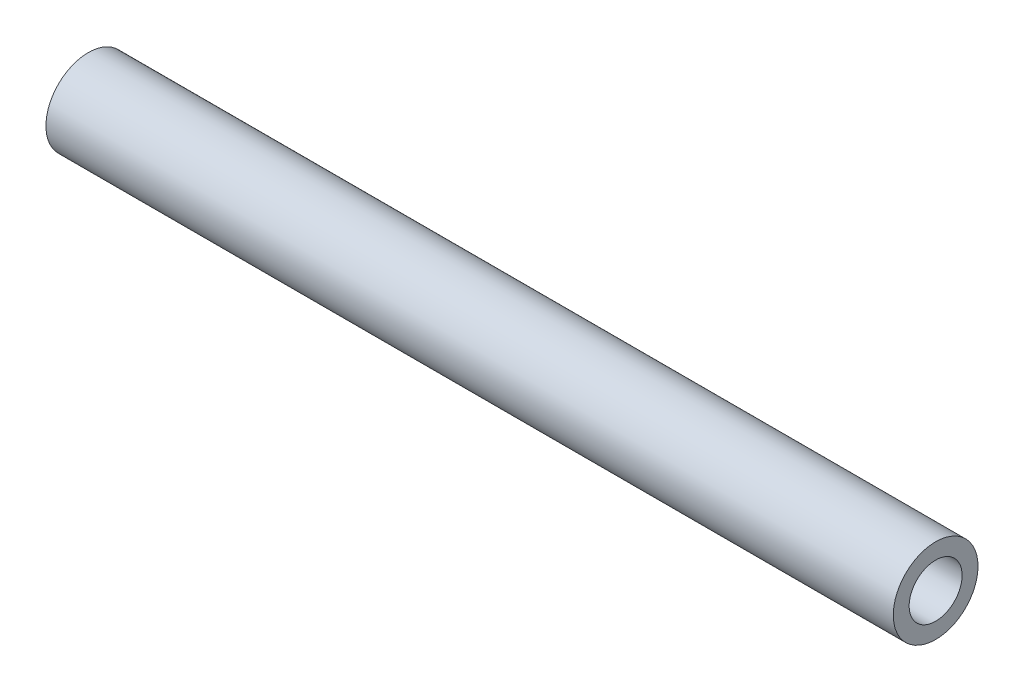
ISO-10303-21;
HEADER;
FILE_DESCRIPTION(('STEP AP214'),'2;1');
FILE_NAME('part.step','',(''),(''),'','','');
FILE_SCHEMA(('AUTOMOTIVE_DESIGN { 1 0 10303 214 1 1 1 1 }'));
ENDSEC;
DATA;
#1=APPLICATION_CONTEXT('core data for automotive mechanical design processes');
#2=APPLICATION_PROTOCOL_DEFINITION('international standard','automotive_design',2000,#1);
#3=PRODUCT_CONTEXT('',#1,'mechanical');
#4=PRODUCT('Part','Part','',(#3));
#5=PRODUCT_RELATED_PRODUCT_CATEGORY('part','',(#4));
#6=PRODUCT_DEFINITION_FORMATION('','',#4);
#7=PRODUCT_DEFINITION_CONTEXT('part definition',#1,'design');
#8=PRODUCT_DEFINITION('design','',#6,#7);
#9=PRODUCT_DEFINITION_SHAPE('','',#8);
#10=(LENGTH_UNIT() NAMED_UNIT(*) SI_UNIT(.MILLI.,.METRE.));
#11=(NAMED_UNIT(*) PLANE_ANGLE_UNIT() SI_UNIT($,.RADIAN.));
#12=(NAMED_UNIT(*) SI_UNIT($,.STERADIAN.) SOLID_ANGLE_UNIT());
#13=UNCERTAINTY_MEASURE_WITH_UNIT(LENGTH_MEASURE(1.E-05),#10,'distance_accuracy_value','');
#14=(GEOMETRIC_REPRESENTATION_CONTEXT(3) GLOBAL_UNCERTAINTY_ASSIGNED_CONTEXT((#13)) GLOBAL_UNIT_ASSIGNED_CONTEXT((#10,
#11,#12)) REPRESENTATION_CONTEXT('',''));
#15=CARTESIAN_POINT('',(0.,0.,0.));
#16=DIRECTION('',(0.,0.,1.));
#17=DIRECTION('',(1.,0.,0.));
#18=AXIS2_PLACEMENT_3D('',#15,#16,#17);
#19=CARTESIAN_POINT('',(127.,0.,0.));
#20=DIRECTION('',(1.,0.,0.));
#21=DIRECTION('',(0.,0.,-1.));
#22=AXIS2_PLACEMENT_3D('',#19,#20,#21);
#23=PLANE('',#22);
#24=CARTESIAN_POINT('',(127.,0.,0.));
#25=DIRECTION('',(1.,0.,0.));
#26=DIRECTION('',(0.,0.,-1.));
#27=AXIS2_PLACEMENT_3D('',#24,#25,#26);
#28=CIRCLE('',#27,6.35);
#29=CARTESIAN_POINT('',(127.,0.,-6.35));
#30=VERTEX_POINT('',#29);
#31=EDGE_CURVE('E10',#30,#30,#28,.T.);
#32=ORIENTED_EDGE('',*,*,#31,.T.);
#33=EDGE_LOOP('',(#32));
#34=FACE_BOUND('',#33,.T.);
#35=CARTESIAN_POINT('',(127.,0.,0.));
#36=DIRECTION('',(1.,0.,0.));
#37=DIRECTION('',(0.,0.,-1.));
#38=AXIS2_PLACEMENT_3D('',#35,#36,#37);
#39=CIRCLE('',#38,3.96875);
#40=CARTESIAN_POINT('',(127.,0.,-3.96875));
#41=VERTEX_POINT('',#40);
#42=EDGE_CURVE('E42',#41,#41,#39,.T.);
#43=ORIENTED_EDGE('',*,*,#42,.F.);
#44=EDGE_LOOP('',(#43));
#45=FACE_BOUND('',#44,.T.);
#46=ADVANCED_FACE('F31',(#34,#45),#23,.T.);
#47=CARTESIAN_POINT('',(0.,0.,0.));
#48=DIRECTION('',(1.,0.,0.));
#49=DIRECTION('',(0.,0.,-1.));
#50=AXIS2_PLACEMENT_3D('',#47,#48,#49);
#51=PLANE('',#50);
#52=CARTESIAN_POINT('',(0.,0.,0.));
#53=DIRECTION('',(1.,0.,0.));
#54=DIRECTION('',(0.,0.,-1.));
#55=AXIS2_PLACEMENT_3D('',#52,#53,#54);
#56=CIRCLE('',#55,6.35);
#57=CARTESIAN_POINT('',(0.,0.,-6.35));
#58=VERTEX_POINT('',#57);
#59=EDGE_CURVE('E35',#58,#58,#56,.T.);
#60=ORIENTED_EDGE('',*,*,#59,.F.);
#61=EDGE_LOOP('',(#60));
#62=FACE_BOUND('',#61,.T.);
#63=CARTESIAN_POINT('',(0.,0.,0.));
#64=DIRECTION('',(1.,0.,0.));
#65=DIRECTION('',(0.,0.,-1.));
#66=AXIS2_PLACEMENT_3D('',#63,#64,#65);
#67=CIRCLE('',#66,3.96875);
#68=CARTESIAN_POINT('',(0.,0.,-3.96875));
#69=VERTEX_POINT('',#68);
#70=EDGE_CURVE('E44',#69,#69,#67,.T.);
#71=ORIENTED_EDGE('',*,*,#70,.T.);
#72=EDGE_LOOP('',(#71));
#73=FACE_BOUND('',#72,.T.);
#74=ADVANCED_FACE('F54',(#62,#73),#51,.F.);
#75=CARTESIAN_POINT('',(127.,0.,0.));
#76=DIRECTION('',(-1.,0.,0.));
#77=DIRECTION('',(0.,0.,1.));
#78=AXIS2_PLACEMENT_3D('',#75,#76,#77);
#79=CYLINDRICAL_SURFACE('',#78,6.35);
#80=ORIENTED_EDGE('',*,*,#31,.F.);
#81=EDGE_LOOP('',(#80));
#82=FACE_BOUND('',#81,.T.);
#83=ORIENTED_EDGE('',*,*,#59,.T.);
#84=EDGE_LOOP('',(#83));
#85=FACE_BOUND('',#84,.T.);
#86=ADVANCED_FACE('F33',(#82,#85),#79,.T.);
#87=CARTESIAN_POINT('',(127.,0.,0.));
#88=DIRECTION('',(-1.,0.,0.));
#89=DIRECTION('',(0.,0.,1.));
#90=AXIS2_PLACEMENT_3D('',#87,#88,#89);
#91=CYLINDRICAL_SURFACE('',#90,3.96875);
#92=ORIENTED_EDGE('',*,*,#42,.T.);
#93=EDGE_LOOP('',(#92));
#94=FACE_BOUND('',#93,.T.);
#95=ORIENTED_EDGE('',*,*,#70,.F.);
#96=EDGE_LOOP('',(#95));
#97=FACE_BOUND('',#96,.T.);
#98=ADVANCED_FACE('F50',(#94,#97),#91,.F.);
#99=CLOSED_SHELL('',(#46,#74,#86,#98));
#100=MANIFOLD_SOLID_BREP('B2',#99);
#101=ADVANCED_BREP_SHAPE_REPRESENTATION('',(#18,#100),#14);
#102=SHAPE_DEFINITION_REPRESENTATION(#9,#101);
ENDSEC;
END-ISO-10303-21;
